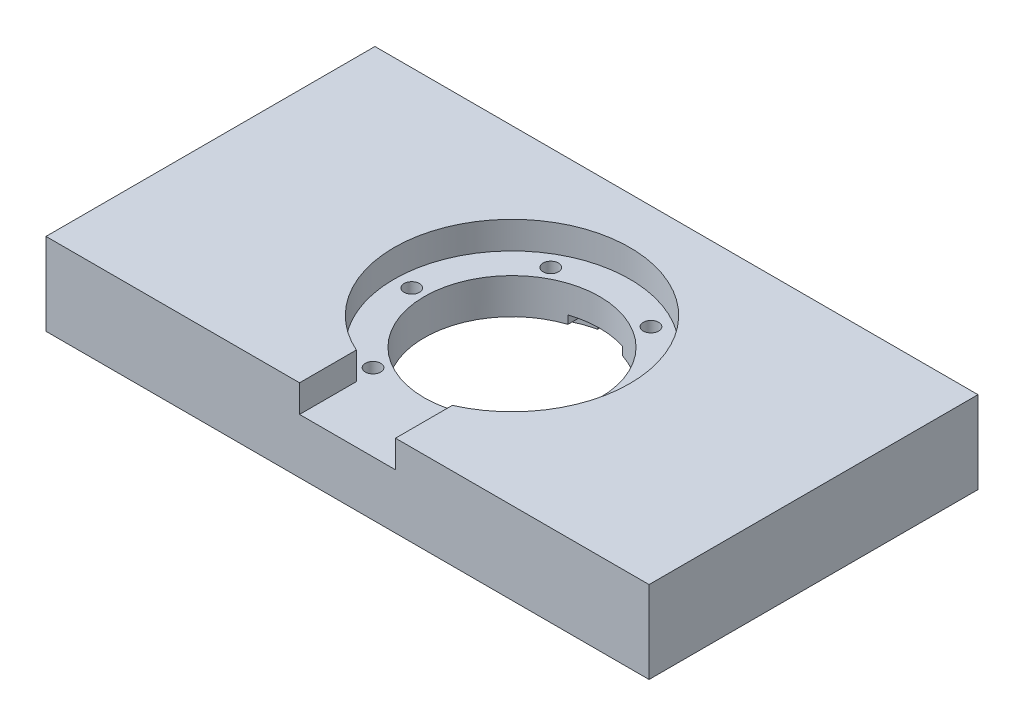
ISO-10303-21;
HEADER;
FILE_DESCRIPTION(('STEP AP214'),'2;1');
FILE_NAME('part.step','',(''),(''),'','','');
FILE_SCHEMA(('AUTOMOTIVE_DESIGN { 1 0 10303 214 1 1 1 1 }'));
ENDSEC;
DATA;
#1=APPLICATION_CONTEXT('core data for automotive mechanical design processes');
#2=APPLICATION_PROTOCOL_DEFINITION('international standard','automotive_design',2000,#1);
#3=PRODUCT_CONTEXT('',#1,'mechanical');
#4=PRODUCT('Part','Part','',(#3));
#5=PRODUCT_RELATED_PRODUCT_CATEGORY('part','',(#4));
#6=PRODUCT_DEFINITION_FORMATION('','',#4);
#7=PRODUCT_DEFINITION_CONTEXT('part definition',#1,'design');
#8=PRODUCT_DEFINITION('design','',#6,#7);
#9=PRODUCT_DEFINITION_SHAPE('','',#8);
#10=(LENGTH_UNIT() NAMED_UNIT(*) SI_UNIT(.MILLI.,.METRE.));
#11=(NAMED_UNIT(*) PLANE_ANGLE_UNIT() SI_UNIT($,.RADIAN.));
#12=(NAMED_UNIT(*) SI_UNIT($,.STERADIAN.) SOLID_ANGLE_UNIT());
#13=UNCERTAINTY_MEASURE_WITH_UNIT(LENGTH_MEASURE(1.E-05),#10,'distance_accuracy_value','');
#14=(GEOMETRIC_REPRESENTATION_CONTEXT(3) GLOBAL_UNCERTAINTY_ASSIGNED_CONTEXT((#13)) GLOBAL_UNIT_ASSIGNED_CONTEXT((#10,
#11,#12)) REPRESENTATION_CONTEXT('',''));
#15=CARTESIAN_POINT('',(0.,0.,0.));
#16=DIRECTION('',(0.,0.,1.));
#17=DIRECTION('',(1.,0.,0.));
#18=AXIS2_PLACEMENT_3D('',#15,#16,#17);
#19=CARTESIAN_POINT('',(18.1221367706661,-20.,32.2581487203663));
#20=DIRECTION('',(0.,1.,0.));
#21=DIRECTION('',(0.,0.,1.));
#22=AXIS2_PLACEMENT_3D('',#19,#20,#21);
#23=CYLINDRICAL_SURFACE('',#22,2.8);
#24=CARTESIAN_POINT('',(18.1221367706661,0.,32.2581487203663));
#25=DIRECTION('',(0.,-1.,0.));
#26=DIRECTION('',(0.,0.,-1.));
#27=AXIS2_PLACEMENT_3D('',#24,#25,#26);
#28=CIRCLE('',#27,2.8);
#29=CARTESIAN_POINT('',(18.1221367706661,0.,29.4581487203663));
#30=VERTEX_POINT('',#29);
#31=EDGE_CURVE('E240',#30,#30,#28,.T.);
#32=ORIENTED_EDGE('',*,*,#31,.F.);
#33=EDGE_LOOP('',(#32));
#34=FACE_BOUND('',#33,.T.);
#35=CARTESIAN_POINT('',(18.1221367706661,-13.,32.2581487203663));
#36=DIRECTION('',(0.,-1.,0.));
#37=DIRECTION('',(0.,0.,-1.));
#38=AXIS2_PLACEMENT_3D('',#35,#36,#37);
#39=CIRCLE('',#38,2.8);
#40=CARTESIAN_POINT('',(18.1221367706661,-13.,29.4581487203663));
#41=VERTEX_POINT('',#40);
#42=EDGE_CURVE('E311',#41,#41,#39,.T.);
#43=ORIENTED_EDGE('',*,*,#42,.T.);
#44=EDGE_LOOP('',(#43));
#45=FACE_BOUND('',#44,.T.);
#46=ADVANCED_FACE('F47',(#34,#45),#23,.F.);
#47=CARTESIAN_POINT('',(36.9974446562268,-20.,0.434843545930153));
#48=DIRECTION('',(0.,1.,0.));
#49=DIRECTION('',(0.,0.,1.));
#50=AXIS2_PLACEMENT_3D('',#47,#48,#49);
#51=CYLINDRICAL_SURFACE('',#50,2.8);
#52=CARTESIAN_POINT('',(36.9974446562268,0.,0.434843545930153));
#53=DIRECTION('',(0.,-1.,0.));
#54=DIRECTION('',(0.,0.,-1.));
#55=AXIS2_PLACEMENT_3D('',#52,#53,#54);
#56=CIRCLE('',#55,2.8);
#57=CARTESIAN_POINT('',(36.9974446562268,0.,-2.36515645406985));
#58=VERTEX_POINT('',#57);
#59=EDGE_CURVE('E236',#58,#58,#56,.T.);
#60=ORIENTED_EDGE('',*,*,#59,.F.);
#61=EDGE_LOOP('',(#60));
#62=FACE_BOUND('',#61,.T.);
#63=CARTESIAN_POINT('',(36.9974446562268,-13.,0.434843545930153));
#64=DIRECTION('',(0.,-1.,0.));
#65=DIRECTION('',(0.,0.,-1.));
#66=AXIS2_PLACEMENT_3D('',#63,#64,#65);
#67=CIRCLE('',#66,2.8);
#68=CARTESIAN_POINT('',(36.9974446562268,-13.,-2.36515645406985));
#69=VERTEX_POINT('',#68);
#70=EDGE_CURVE('E378',#69,#69,#67,.T.);
#71=ORIENTED_EDGE('',*,*,#70,.T.);
#72=EDGE_LOOP('',(#71));
#73=FACE_BOUND('',#72,.T.);
#74=ADVANCED_FACE('F416',(#62,#73),#51,.F.);
#75=CARTESIAN_POINT('',(18.8753078855607,-20.,-31.8233051744363));
#76=DIRECTION('',(0.,1.,0.));
#77=DIRECTION('',(0.,0.,1.));
#78=AXIS2_PLACEMENT_3D('',#75,#76,#77);
#79=CYLINDRICAL_SURFACE('',#78,2.8);
#80=CARTESIAN_POINT('',(18.8753078855607,0.,-31.8233051744363));
#81=DIRECTION('',(0.,-1.,0.));
#82=DIRECTION('',(0.,0.,-1.));
#83=AXIS2_PLACEMENT_3D('',#80,#81,#82);
#84=CIRCLE('',#83,2.8);
#85=CARTESIAN_POINT('',(18.8753078855607,0.,-34.6233051744363));
#86=VERTEX_POINT('',#85);
#87=EDGE_CURVE('E232',#86,#86,#84,.T.);
#88=ORIENTED_EDGE('',*,*,#87,.F.);
#89=EDGE_LOOP('',(#88));
#90=FACE_BOUND('',#89,.T.);
#91=CARTESIAN_POINT('',(18.8753078855607,-13.,-31.8233051744363));
#92=DIRECTION('',(0.,-1.,0.));
#93=DIRECTION('',(0.,0.,-1.));
#94=AXIS2_PLACEMENT_3D('',#91,#92,#93);
#95=CIRCLE('',#94,2.8);
#96=CARTESIAN_POINT('',(18.8753078855607,-13.,-34.6233051744363));
#97=VERTEX_POINT('',#96);
#98=EDGE_CURVE('E374',#97,#97,#95,.T.);
#99=ORIENTED_EDGE('',*,*,#98,.T.);
#100=EDGE_LOOP('',(#99));
#101=FACE_BOUND('',#100,.T.);
#102=ADVANCED_FACE('F423',(#90,#101),#79,.F.);
#103=CARTESIAN_POINT('',(-18.1221367706662,-20.,-32.2581487203665));
#104=DIRECTION('',(0.,1.,0.));
#105=DIRECTION('',(0.,0.,1.));
#106=AXIS2_PLACEMENT_3D('',#103,#104,#105);
#107=CYLINDRICAL_SURFACE('',#106,2.8);
#108=CARTESIAN_POINT('',(-18.1221367706662,0.,-32.2581487203665));
#109=DIRECTION('',(0.,-1.,0.));
#110=DIRECTION('',(0.,0.,-1.));
#111=AXIS2_PLACEMENT_3D('',#108,#109,#110);
#112=CIRCLE('',#111,2.8);
#113=CARTESIAN_POINT('',(-18.1221367706662,0.,-35.0581487203665));
#114=VERTEX_POINT('',#113);
#115=EDGE_CURVE('E228',#114,#114,#112,.T.);
#116=ORIENTED_EDGE('',*,*,#115,.F.);
#117=EDGE_LOOP('',(#116));
#118=FACE_BOUND('',#117,.T.);
#119=CARTESIAN_POINT('',(-18.1221367706662,-13.,-32.2581487203665));
#120=DIRECTION('',(0.,-1.,0.));
#121=DIRECTION('',(0.,0.,-1.));
#122=AXIS2_PLACEMENT_3D('',#119,#120,#121);
#123=CIRCLE('',#122,2.8);
#124=CARTESIAN_POINT('',(-18.1221367706662,-13.,-35.0581487203665));
#125=VERTEX_POINT('',#124);
#126=EDGE_CURVE('E370',#125,#125,#123,.T.);
#127=ORIENTED_EDGE('',*,*,#126,.T.);
#128=EDGE_LOOP('',(#127));
#129=FACE_BOUND('',#128,.T.);
#130=ADVANCED_FACE('F410',(#118,#129),#107,.F.);
#131=CARTESIAN_POINT('',(-36.9974446562269,-20.,-0.434843545930336));
#132=DIRECTION('',(0.,1.,0.));
#133=DIRECTION('',(0.,0.,1.));
#134=AXIS2_PLACEMENT_3D('',#131,#132,#133);
#135=CYLINDRICAL_SURFACE('',#134,2.8);
#136=CARTESIAN_POINT('',(-36.9974446562269,0.,-0.434843545930336));
#137=DIRECTION('',(0.,-1.,0.));
#138=DIRECTION('',(0.,0.,-1.));
#139=AXIS2_PLACEMENT_3D('',#136,#137,#138);
#140=CIRCLE('',#139,2.8);
#141=CARTESIAN_POINT('',(-36.9974446562269,0.,-3.23484354593033));
#142=VERTEX_POINT('',#141);
#143=EDGE_CURVE('E224',#142,#142,#140,.T.);
#144=ORIENTED_EDGE('',*,*,#143,.F.);
#145=EDGE_LOOP('',(#144));
#146=FACE_BOUND('',#145,.T.);
#147=CARTESIAN_POINT('',(-36.9974446562269,-13.,-0.434843545930336));
#148=DIRECTION('',(0.,-1.,0.));
#149=DIRECTION('',(0.,0.,-1.));
#150=AXIS2_PLACEMENT_3D('',#147,#148,#149);
#151=CIRCLE('',#150,2.8);
#152=CARTESIAN_POINT('',(-36.9974446562269,-13.,-3.23484354593033));
#153=VERTEX_POINT('',#152);
#154=EDGE_CURVE('E363',#153,#153,#151,.T.);
#155=ORIENTED_EDGE('',*,*,#154,.T.);
#156=EDGE_LOOP('',(#155));
#157=FACE_BOUND('',#156,.T.);
#158=ADVANCED_FACE('F401',(#146,#157),#135,.F.);
#159=CARTESIAN_POINT('',(-18.8753078855608,-20.,31.8233051744361));
#160=DIRECTION('',(0.,1.,0.));
#161=DIRECTION('',(0.,0.,1.));
#162=AXIS2_PLACEMENT_3D('',#159,#160,#161);
#163=CYLINDRICAL_SURFACE('',#162,2.8);
#164=CARTESIAN_POINT('',(-18.8753078855608,0.,31.8233051744361));
#165=DIRECTION('',(0.,-1.,0.));
#166=DIRECTION('',(0.,0.,-1.));
#167=AXIS2_PLACEMENT_3D('',#164,#165,#166);
#168=CIRCLE('',#167,2.8);
#169=CARTESIAN_POINT('',(-18.8753078855608,0.,29.0233051744361));
#170=VERTEX_POINT('',#169);
#171=EDGE_CURVE('E211',#170,#170,#168,.T.);
#172=ORIENTED_EDGE('',*,*,#171,.F.);
#173=EDGE_LOOP('',(#172));
#174=FACE_BOUND('',#173,.T.);
#175=CARTESIAN_POINT('',(-18.8753078855608,-13.,31.8233051744361));
#176=DIRECTION('',(0.,-1.,0.));
#177=DIRECTION('',(0.,0.,-1.));
#178=AXIS2_PLACEMENT_3D('',#175,#176,#177);
#179=CIRCLE('',#178,2.8);
#180=CARTESIAN_POINT('',(-18.8753078855608,-13.,29.0233051744361));
#181=VERTEX_POINT('',#180);
#182=EDGE_CURVE('E358',#181,#181,#179,.T.);
#183=ORIENTED_EDGE('',*,*,#182,.T.);
#184=EDGE_LOOP('',(#183));
#185=FACE_BOUND('',#184,.T.);
#186=ADVANCED_FACE('F399',(#174,#185),#163,.F.);
#187=CARTESIAN_POINT('',(0.,-20.,0.));
#188=DIRECTION('',(0.,1.,0.));
#189=DIRECTION('',(0.,0.,1.));
#190=AXIS2_PLACEMENT_3D('',#187,#188,#189);
#191=CYLINDRICAL_SURFACE('',#190,32.);
#192=CARTESIAN_POINT('',(0.,0.,0.));
#193=DIRECTION('',(0.,1.,0.));
#194=DIRECTION('',(0.,0.,1.));
#195=AXIS2_PLACEMENT_3D('',#192,#193,#194);
#196=CIRCLE('',#195,32.);
#197=CARTESIAN_POINT('',(0.,0.,32.));
#198=VERTEX_POINT('',#197);
#199=EDGE_CURVE('E184',#198,#198,#196,.T.);
#200=ORIENTED_EDGE('',*,*,#199,.T.);
#201=EDGE_LOOP('',(#200));
#202=FACE_BOUND('',#201,.T.);
#203=CARTESIAN_POINT('',(0.,-13.,0.));
#204=DIRECTION('',(0.,-1.,0.));
#205=DIRECTION('',(0.,0.,-1.));
#206=AXIS2_PLACEMENT_3D('',#203,#204,#205);
#207=CIRCLE('',#206,32.);
#208=CARTESIAN_POINT('',(-10.,-13.,-30.3973683071413));
#209=VERTEX_POINT('',#208);
#210=CARTESIAN_POINT('',(9.99999999999999,-13.,-30.3973683071413));
#211=VERTEX_POINT('',#210);
#212=EDGE_CURVE('E63',#209,#211,#207,.F.);
#213=ORIENTED_EDGE('',*,*,#212,.F.);
#214=DIRECTION('',(0.,1.,0.));
#215=VECTOR('',#214,1.);
#216=CARTESIAN_POINT('',(-10.,-20.,-30.3973683071413));
#217=LINE('',#216,#215);
#218=CARTESIAN_POINT('',(-10.,-10.,-30.3973683071413));
#219=VERTEX_POINT('',#218);
#220=EDGE_CURVE('E304',#219,#209,#217,.F.);
#221=ORIENTED_EDGE('',*,*,#220,.F.);
#222=CARTESIAN_POINT('',(0.,-10.,0.));
#223=DIRECTION('',(0.,1.,0.));
#224=DIRECTION('',(0.,0.,1.));
#225=AXIS2_PLACEMENT_3D('',#222,#223,#224);
#226=CIRCLE('',#225,32.);
#227=CARTESIAN_POINT('',(9.99999999999999,-10.,-30.3973683071413));
#228=VERTEX_POINT('',#227);
#229=EDGE_CURVE('E173',#228,#219,#226,.T.);
#230=ORIENTED_EDGE('',*,*,#229,.F.);
#231=DIRECTION('',(0.,1.,0.));
#232=VECTOR('',#231,1.);
#233=CARTESIAN_POINT('',(9.99999999999999,-20.,-30.3973683071413));
#234=LINE('',#233,#232);
#235=EDGE_CURVE('E70',#211,#228,#234,.T.);
#236=ORIENTED_EDGE('',*,*,#235,.F.);
#237=EDGE_LOOP('',(#213,#221,#230,#236));
#238=FACE_BOUND('',#237,.T.);
#239=ADVANCED_FACE('F300',(#202,#238),#191,.F.);
#240=CARTESIAN_POINT('',(0.,10.,0.));
#241=DIRECTION('',(0.,1.,0.));
#242=DIRECTION('',(0.,0.,1.));
#243=AXIS2_PLACEMENT_3D('',#240,#241,#242);
#244=PLANE('',#243);
#245=DIRECTION('',(0.,0.,1.));
#246=VECTOR('',#245,1.);
#247=CARTESIAN_POINT('',(-17.5,10.,-60.001));
#248=LINE('',#247,#246);
#249=CARTESIAN_POINT('',(-17.5,10.,39.2778563569857));
#250=VERTEX_POINT('',#249);
#251=CARTESIAN_POINT('',(-17.5,10.,60.));
#252=VERTEX_POINT('',#251);
#253=EDGE_CURVE('E215',#250,#252,#248,.T.);
#254=ORIENTED_EDGE('',*,*,#253,.F.);
#255=CARTESIAN_POINT('',(0.,10.,0.));
#256=DIRECTION('',(0.,1.,0.));
#257=DIRECTION('',(0.,0.,1.));
#258=AXIS2_PLACEMENT_3D('',#255,#256,#257);
#259=CIRCLE('',#258,43.);
#260=CARTESIAN_POINT('',(17.5,10.,39.2778563569857));
#261=VERTEX_POINT('',#260);
#262=EDGE_CURVE('E261',#261,#250,#259,.T.);
#263=ORIENTED_EDGE('',*,*,#262,.F.);
#264=DIRECTION('',(0.,0.,1.));
#265=VECTOR('',#264,1.);
#266=CARTESIAN_POINT('',(17.5,10.,-60.001));
#267=LINE('',#266,#265);
#268=CARTESIAN_POINT('',(17.5,10.,60.));
#269=VERTEX_POINT('',#268);
#270=EDGE_CURVE('E207',#261,#269,#267,.T.);
#271=ORIENTED_EDGE('',*,*,#270,.T.);
#272=DIRECTION('',(1.,0.,0.));
#273=VECTOR('',#272,1.);
#274=CARTESIAN_POINT('',(110.,10.,60.));
#275=LINE('',#274,#273);
#276=CARTESIAN_POINT('',(110.,10.,60.));
#277=VERTEX_POINT('',#276);
#278=EDGE_CURVE('E272',#269,#277,#275,.T.);
#279=ORIENTED_EDGE('',*,*,#278,.T.);
#280=DIRECTION('',(0.,0.,-1.));
#281=VECTOR('',#280,1.);
#282=CARTESIAN_POINT('',(110.,10.,60.));
#283=LINE('',#282,#281);
#284=CARTESIAN_POINT('',(110.,10.,-60.));
#285=VERTEX_POINT('',#284);
#286=EDGE_CURVE('E277',#277,#285,#283,.T.);
#287=ORIENTED_EDGE('',*,*,#286,.T.);
#288=DIRECTION('',(-1.,0.,0.));
#289=VECTOR('',#288,1.);
#290=CARTESIAN_POINT('',(110.,10.,-60.));
#291=LINE('',#290,#289);
#292=CARTESIAN_POINT('',(-110.,10.,-60.));
#293=VERTEX_POINT('',#292);
#294=EDGE_CURVE('E280',#285,#293,#291,.T.);
#295=ORIENTED_EDGE('',*,*,#294,.T.);
#296=DIRECTION('',(0.,0.,1.));
#297=VECTOR('',#296,1.);
#298=CARTESIAN_POINT('',(-110.,10.,60.));
#299=LINE('',#298,#297);
#300=CARTESIAN_POINT('',(-110.,10.,60.));
#301=VERTEX_POINT('',#300);
#302=EDGE_CURVE('E265',#293,#301,#299,.T.);
#303=ORIENTED_EDGE('',*,*,#302,.T.);
#304=EDGE_CURVE('E273',#301,#252,#275,.T.);
#305=ORIENTED_EDGE('',*,*,#304,.T.);
#306=EDGE_LOOP('',(#254,#263,#271,#279,#287,#295,#303,#305));
#307=FACE_BOUND('',#306,.T.);
#308=ADVANCED_FACE('F337',(#307),#244,.T.);
#309=CARTESIAN_POINT('',(-110.,10.,60.));
#310=DIRECTION('',(1.,0.,0.));
#311=DIRECTION('',(0.,0.,-1.));
#312=AXIS2_PLACEMENT_3D('',#309,#310,#311);
#313=PLANE('',#312);
#314=DIRECTION('',(0.,-1.,0.));
#315=VECTOR('',#314,1.);
#316=CARTESIAN_POINT('',(-110.,10.,-60.));
#317=LINE('',#316,#315);
#318=CARTESIAN_POINT('',(-110.,-20.,-60.));
#319=VERTEX_POINT('',#318);
#320=EDGE_CURVE('E283',#293,#319,#317,.T.);
#321=ORIENTED_EDGE('',*,*,#320,.T.);
#322=DIRECTION('',(0.,0.,-1.));
#323=VECTOR('',#322,1.);
#324=CARTESIAN_POINT('',(-110.,-20.,60.));
#325=LINE('',#324,#323);
#326=CARTESIAN_POINT('',(-110.,-20.,60.));
#327=VERTEX_POINT('',#326);
#328=EDGE_CURVE('E244',#327,#319,#325,.T.);
#329=ORIENTED_EDGE('',*,*,#328,.F.);
#330=DIRECTION('',(0.,-1.,0.));
#331=VECTOR('',#330,1.);
#332=CARTESIAN_POINT('',(-110.,10.,60.));
#333=LINE('',#332,#331);
#334=EDGE_CURVE('E293',#301,#327,#333,.T.);
#335=ORIENTED_EDGE('',*,*,#334,.F.);
#336=ORIENTED_EDGE('',*,*,#302,.F.);
#337=EDGE_LOOP('',(#321,#329,#335,#336));
#338=FACE_BOUND('',#337,.T.);
#339=ADVANCED_FACE('F49',(#338),#313,.F.);
#340=CARTESIAN_POINT('',(110.,10.,60.));
#341=DIRECTION('',(0.,0.,-1.));
#342=DIRECTION('',(-1.,0.,0.));
#343=AXIS2_PLACEMENT_3D('',#340,#341,#342);
#344=PLANE('',#343);
#345=DIRECTION('',(1.,0.,0.));
#346=VECTOR('',#345,1.);
#347=CARTESIAN_POINT('',(-17.5,0.,60.));
#348=LINE('',#347,#346);
#349=CARTESIAN_POINT('',(-17.5,0.,60.));
#350=VERTEX_POINT('',#349);
#351=CARTESIAN_POINT('',(17.5,0.,60.));
#352=VERTEX_POINT('',#351);
#353=EDGE_CURVE('E203',#350,#352,#348,.T.);
#354=ORIENTED_EDGE('',*,*,#353,.F.);
#355=DIRECTION('',(0.,-1.,0.));
#356=VECTOR('',#355,1.);
#357=CARTESIAN_POINT('',(-17.5,0.,60.));
#358=LINE('',#357,#356);
#359=EDGE_CURVE('E199',#252,#350,#358,.T.);
#360=ORIENTED_EDGE('',*,*,#359,.F.);
#361=ORIENTED_EDGE('',*,*,#304,.F.);
#362=ORIENTED_EDGE('',*,*,#334,.T.);
#363=DIRECTION('',(-1.,0.,0.));
#364=VECTOR('',#363,1.);
#365=CARTESIAN_POINT('',(-110.,-20.,60.));
#366=LINE('',#365,#364);
#367=CARTESIAN_POINT('',(110.,-20.,60.));
#368=VERTEX_POINT('',#367);
#369=EDGE_CURVE('E256',#368,#327,#366,.T.);
#370=ORIENTED_EDGE('',*,*,#369,.F.);
#371=DIRECTION('',(0.,-1.,0.));
#372=VECTOR('',#371,1.);
#373=CARTESIAN_POINT('',(110.,10.,60.));
#374=LINE('',#373,#372);
#375=EDGE_CURVE('E290',#277,#368,#374,.T.);
#376=ORIENTED_EDGE('',*,*,#375,.F.);
#377=ORIENTED_EDGE('',*,*,#278,.F.);
#378=DIRECTION('',(0.,1.,0.));
#379=VECTOR('',#378,1.);
#380=CARTESIAN_POINT('',(17.5,0.,60.));
#381=LINE('',#380,#379);
#382=EDGE_CURVE('E196',#352,#269,#381,.T.);
#383=ORIENTED_EDGE('',*,*,#382,.F.);
#384=EDGE_LOOP('',(#354,#360,#361,#362,#370,#376,#377,#383));
#385=FACE_BOUND('',#384,.T.);
#386=ADVANCED_FACE('F344',(#385),#344,.F.);
#387=CARTESIAN_POINT('',(110.,10.,60.));
#388=DIRECTION('',(-1.,0.,0.));
#389=DIRECTION('',(0.,0.,1.));
#390=AXIS2_PLACEMENT_3D('',#387,#388,#389);
#391=PLANE('',#390);
#392=ORIENTED_EDGE('',*,*,#375,.T.);
#393=DIRECTION('',(0.,0.,1.));
#394=VECTOR('',#393,1.);
#395=CARTESIAN_POINT('',(110.,-20.,60.));
#396=LINE('',#395,#394);
#397=CARTESIAN_POINT('',(110.,-20.,-60.));
#398=VERTEX_POINT('',#397);
#399=EDGE_CURVE('E252',#398,#368,#396,.T.);
#400=ORIENTED_EDGE('',*,*,#399,.F.);
#401=DIRECTION('',(0.,-1.,0.));
#402=VECTOR('',#401,1.);
#403=CARTESIAN_POINT('',(110.,10.,-60.));
#404=LINE('',#403,#402);
#405=EDGE_CURVE('E286',#285,#398,#404,.T.);
#406=ORIENTED_EDGE('',*,*,#405,.F.);
#407=ORIENTED_EDGE('',*,*,#286,.F.);
#408=EDGE_LOOP('',(#392,#400,#406,#407));
#409=FACE_BOUND('',#408,.T.);
#410=ADVANCED_FACE('F346',(#409),#391,.F.);
#411=CARTESIAN_POINT('',(110.,10.,-60.));
#412=DIRECTION('',(0.,0.,1.));
#413=DIRECTION('',(1.,0.,0.));
#414=AXIS2_PLACEMENT_3D('',#411,#412,#413);
#415=PLANE('',#414);
#416=DIRECTION('',(1.,0.,0.));
#417=VECTOR('',#416,1.);
#418=CARTESIAN_POINT('',(9.99999999999999,-10.,-60.));
#419=LINE('',#418,#417);
#420=CARTESIAN_POINT('',(-10.,-10.,-60.));
#421=VERTEX_POINT('',#420);
#422=CARTESIAN_POINT('',(9.99999999999999,-10.,-60.));
#423=VERTEX_POINT('',#422);
#424=EDGE_CURVE('E318',#421,#423,#419,.T.);
#425=ORIENTED_EDGE('',*,*,#424,.F.);
#426=DIRECTION('',(0.,1.,0.));
#427=VECTOR('',#426,1.);
#428=CARTESIAN_POINT('',(-10.,-10.,-60.));
#429=LINE('',#428,#427);
#430=CARTESIAN_POINT('',(-10.,-20.,-60.));
#431=VERTEX_POINT('',#430);
#432=EDGE_CURVE('E309',#431,#421,#429,.T.);
#433=ORIENTED_EDGE('',*,*,#432,.F.);
#434=DIRECTION('',(1.,0.,0.));
#435=VECTOR('',#434,1.);
#436=CARTESIAN_POINT('',(-110.,-20.,-60.));
#437=LINE('',#436,#435);
#438=EDGE_CURVE('E249',#319,#431,#437,.T.);
#439=ORIENTED_EDGE('',*,*,#438,.F.);
#440=ORIENTED_EDGE('',*,*,#320,.F.);
#441=ORIENTED_EDGE('',*,*,#294,.F.);
#442=ORIENTED_EDGE('',*,*,#405,.T.);
#443=CARTESIAN_POINT('',(9.99999999999999,-20.,-60.));
#444=VERTEX_POINT('',#443);
#445=EDGE_CURVE('E248',#444,#398,#437,.T.);
#446=ORIENTED_EDGE('',*,*,#445,.F.);
#447=DIRECTION('',(0.,-1.,0.));
#448=VECTOR('',#447,1.);
#449=CARTESIAN_POINT('',(9.99999999999999,-10.,-60.));
#450=LINE('',#449,#448);
#451=EDGE_CURVE('E166',#423,#444,#450,.T.);
#452=ORIENTED_EDGE('',*,*,#451,.F.);
#453=EDGE_LOOP('',(#425,#433,#439,#440,#441,#442,#446,#452));
#454=FACE_BOUND('',#453,.T.);
#455=ADVANCED_FACE('F327',(#454),#415,.F.);
#456=CARTESIAN_POINT('',(0.,10.,0.));
#457=DIRECTION('',(0.,-1.,0.));
#458=DIRECTION('',(0.,0.,-1.));
#459=AXIS2_PLACEMENT_3D('',#456,#457,#458);
#460=CYLINDRICAL_SURFACE('',#459,43.);
#461=DIRECTION('',(0.,-1.,0.));
#462=VECTOR('',#461,1.);
#463=CARTESIAN_POINT('',(-17.5,10.,39.2778563569857));
#464=LINE('',#463,#462);
#465=CARTESIAN_POINT('',(-17.5,0.,39.2778563569857));
#466=VERTEX_POINT('',#465);
#467=EDGE_CURVE('E188',#250,#466,#464,.T.);
#468=ORIENTED_EDGE('',*,*,#467,.T.);
#469=CARTESIAN_POINT('',(0.,0.,0.));
#470=DIRECTION('',(0.,1.,0.));
#471=DIRECTION('',(0.,0.,1.));
#472=AXIS2_PLACEMENT_3D('',#469,#470,#471);
#473=CIRCLE('',#472,43.);
#474=CARTESIAN_POINT('',(17.5,0.,39.2778563569857));
#475=VERTEX_POINT('',#474);
#476=EDGE_CURVE('E260',#475,#466,#473,.T.);
#477=ORIENTED_EDGE('',*,*,#476,.F.);
#478=DIRECTION('',(0.,-1.,0.));
#479=VECTOR('',#478,1.);
#480=CARTESIAN_POINT('',(17.5,10.,39.2778563569857));
#481=LINE('',#480,#479);
#482=EDGE_CURVE('E192',#475,#261,#481,.F.);
#483=ORIENTED_EDGE('',*,*,#482,.T.);
#484=ORIENTED_EDGE('',*,*,#262,.T.);
#485=EDGE_LOOP('',(#468,#477,#483,#484));
#486=FACE_BOUND('',#485,.T.);
#487=ADVANCED_FACE('F435',(#486),#460,.F.);
#488=CARTESIAN_POINT('',(0.,0.,0.));
#489=DIRECTION('',(0.,-1.,0.));
#490=DIRECTION('',(0.,0.,-1.));
#491=AXIS2_PLACEMENT_3D('',#488,#489,#490);
#492=PLANE('',#491);
#493=ORIENTED_EDGE('',*,*,#199,.F.);
#494=EDGE_LOOP('',(#493));
#495=FACE_BOUND('',#494,.T.);
#496=ORIENTED_EDGE('',*,*,#171,.T.);
#497=EDGE_LOOP('',(#496));
#498=FACE_BOUND('',#497,.T.);
#499=ORIENTED_EDGE('',*,*,#143,.T.);
#500=EDGE_LOOP('',(#499));
#501=FACE_BOUND('',#500,.T.);
#502=ORIENTED_EDGE('',*,*,#115,.T.);
#503=EDGE_LOOP('',(#502));
#504=FACE_BOUND('',#503,.T.);
#505=ORIENTED_EDGE('',*,*,#87,.T.);
#506=EDGE_LOOP('',(#505));
#507=FACE_BOUND('',#506,.T.);
#508=ORIENTED_EDGE('',*,*,#59,.T.);
#509=EDGE_LOOP('',(#508));
#510=FACE_BOUND('',#509,.T.);
#511=ORIENTED_EDGE('',*,*,#31,.T.);
#512=EDGE_LOOP('',(#511));
#513=FACE_BOUND('',#512,.T.);
#514=ORIENTED_EDGE('',*,*,#476,.T.);
#515=DIRECTION('',(0.,0.,1.));
#516=VECTOR('',#515,1.);
#517=CARTESIAN_POINT('',(-17.5,0.,-60.001));
#518=LINE('',#517,#516);
#519=EDGE_CURVE('E212',#466,#350,#518,.T.);
#520=ORIENTED_EDGE('',*,*,#519,.T.);
#521=ORIENTED_EDGE('',*,*,#353,.T.);
#522=DIRECTION('',(0.,0.,1.));
#523=VECTOR('',#522,1.);
#524=CARTESIAN_POINT('',(17.5,0.,-60.001));
#525=LINE('',#524,#523);
#526=EDGE_CURVE('E208',#475,#352,#525,.T.);
#527=ORIENTED_EDGE('',*,*,#526,.F.);
#528=EDGE_LOOP('',(#514,#520,#521,#527));
#529=FACE_BOUND('',#528,.T.);
#530=ADVANCED_FACE('F432',(#495,#498,#501,#504,#507,#510,#513,#529),#492,.F.);
#531=CARTESIAN_POINT('',(0.,-20.,0.));
#532=DIRECTION('',(0.,-1.,0.));
#533=DIRECTION('',(0.,0.,-1.));
#534=AXIS2_PLACEMENT_3D('',#531,#532,#533);
#535=PLANE('',#534);
#536=CARTESIAN_POINT('',(0.,-20.,0.));
#537=DIRECTION('',(0.,-1.,0.));
#538=DIRECTION('',(0.,0.,-1.));
#539=AXIS2_PLACEMENT_3D('',#536,#537,#538);
#540=CIRCLE('',#539,42.5);
#541=CARTESIAN_POINT('',(9.99999999999999,-20.,-41.3067791046458));
#542=VERTEX_POINT('',#541);
#543=CARTESIAN_POINT('',(-10.,-20.,-41.3067791046458));
#544=VERTEX_POINT('',#543);
#545=EDGE_CURVE('E150',#542,#544,#540,.T.);
#546=ORIENTED_EDGE('',*,*,#545,.F.);
#547=DIRECTION('',(0.,0.,-1.));
#548=VECTOR('',#547,1.);
#549=CARTESIAN_POINT('',(10.,-20.,60.001));
#550=LINE('',#549,#548);
#551=EDGE_CURVE('E158',#542,#444,#550,.T.);
#552=ORIENTED_EDGE('',*,*,#551,.T.);
#553=ORIENTED_EDGE('',*,*,#445,.T.);
#554=ORIENTED_EDGE('',*,*,#399,.T.);
#555=ORIENTED_EDGE('',*,*,#369,.T.);
#556=ORIENTED_EDGE('',*,*,#328,.T.);
#557=ORIENTED_EDGE('',*,*,#438,.T.);
#558=DIRECTION('',(0.,0.,-1.));
#559=VECTOR('',#558,1.);
#560=CARTESIAN_POINT('',(-9.99999999999999,-20.,60.001));
#561=LINE('',#560,#559);
#562=EDGE_CURVE('E161',#544,#431,#561,.T.);
#563=ORIENTED_EDGE('',*,*,#562,.F.);
#564=EDGE_LOOP('',(#546,#552,#553,#554,#555,#556,#557,#563));
#565=FACE_BOUND('',#564,.T.);
#566=ADVANCED_FACE('F157',(#565),#535,.T.);
#567=CARTESIAN_POINT('',(-17.5,0.,-60.001));
#568=DIRECTION('',(-1.,0.,0.));
#569=DIRECTION('',(0.,0.,1.));
#570=AXIS2_PLACEMENT_3D('',#567,#568,#569);
#571=PLANE('',#570);
#572=ORIENTED_EDGE('',*,*,#253,.T.);
#573=ORIENTED_EDGE('',*,*,#359,.T.);
#574=ORIENTED_EDGE('',*,*,#519,.F.);
#575=ORIENTED_EDGE('',*,*,#467,.F.);
#576=EDGE_LOOP('',(#572,#573,#574,#575));
#577=FACE_BOUND('',#576,.T.);
#578=ADVANCED_FACE('F431',(#577),#571,.F.);
#579=CARTESIAN_POINT('',(17.5,0.,-60.001));
#580=DIRECTION('',(1.,0.,0.));
#581=DIRECTION('',(0.,0.,-1.));
#582=AXIS2_PLACEMENT_3D('',#579,#580,#581);
#583=PLANE('',#582);
#584=ORIENTED_EDGE('',*,*,#526,.T.);
#585=ORIENTED_EDGE('',*,*,#382,.T.);
#586=ORIENTED_EDGE('',*,*,#270,.F.);
#587=ORIENTED_EDGE('',*,*,#482,.F.);
#588=EDGE_LOOP('',(#584,#585,#586,#587));
#589=FACE_BOUND('',#588,.T.);
#590=ADVANCED_FACE('F500',(#589),#583,.F.);
#591=CARTESIAN_POINT('',(-9.99999999999999,-10.,60.001));
#592=DIRECTION('',(-1.,0.,0.));
#593=DIRECTION('',(0.,-1.,0.));
#594=AXIS2_PLACEMENT_3D('',#591,#592,#593);
#595=PLANE('',#594);
#596=DIRECTION('',(0.,0.,1.));
#597=VECTOR('',#596,1.);
#598=CARTESIAN_POINT('',(-9.99999999999999,-13.,60.001));
#599=LINE('',#598,#597);
#600=CARTESIAN_POINT('',(-10.,-13.,-41.3067791046458));
#601=VERTEX_POINT('',#600);
#602=EDGE_CURVE('E356',#601,#209,#599,.T.);
#603=ORIENTED_EDGE('',*,*,#602,.F.);
#604=DIRECTION('',(0.,-1.,0.));
#605=VECTOR('',#604,1.);
#606=CARTESIAN_POINT('',(-10.,-13.,-41.3067791046458));
#607=LINE('',#606,#605);
#608=EDGE_CURVE('E305',#601,#544,#607,.T.);
#609=ORIENTED_EDGE('',*,*,#608,.T.);
#610=ORIENTED_EDGE('',*,*,#562,.T.);
#611=ORIENTED_EDGE('',*,*,#432,.T.);
#612=DIRECTION('',(0.,0.,-1.));
#613=VECTOR('',#612,1.);
#614=CARTESIAN_POINT('',(-9.99999999999999,-10.,60.001));
#615=LINE('',#614,#613);
#616=EDGE_CURVE('E175',#219,#421,#615,.T.);
#617=ORIENTED_EDGE('',*,*,#616,.F.);
#618=ORIENTED_EDGE('',*,*,#220,.T.);
#619=EDGE_LOOP('',(#603,#609,#610,#611,#617,#618));
#620=FACE_BOUND('',#619,.T.);
#621=ADVANCED_FACE('F355',(#620),#595,.F.);
#622=CARTESIAN_POINT('',(10.,-10.,60.001));
#623=DIRECTION('',(1.,0.,0.));
#624=DIRECTION('',(0.,1.,0.));
#625=AXIS2_PLACEMENT_3D('',#622,#623,#624);
#626=PLANE('',#625);
#627=ORIENTED_EDGE('',*,*,#551,.F.);
#628=DIRECTION('',(0.,-1.,0.));
#629=VECTOR('',#628,1.);
#630=CARTESIAN_POINT('',(9.99999999999999,-13.,-41.3067791046458));
#631=LINE('',#630,#629);
#632=CARTESIAN_POINT('',(9.99999999999999,-13.,-41.3067791046458));
#633=VERTEX_POINT('',#632);
#634=EDGE_CURVE('E11',#542,#633,#631,.F.);
#635=ORIENTED_EDGE('',*,*,#634,.T.);
#636=DIRECTION('',(0.,0.,-1.));
#637=VECTOR('',#636,1.);
#638=CARTESIAN_POINT('',(10.,-13.,60.001));
#639=LINE('',#638,#637);
#640=EDGE_CURVE('E56',#211,#633,#639,.T.);
#641=ORIENTED_EDGE('',*,*,#640,.F.);
#642=ORIENTED_EDGE('',*,*,#235,.T.);
#643=DIRECTION('',(0.,0.,-1.));
#644=VECTOR('',#643,1.);
#645=CARTESIAN_POINT('',(10.,-10.,60.001));
#646=LINE('',#645,#644);
#647=EDGE_CURVE('E169',#228,#423,#646,.T.);
#648=ORIENTED_EDGE('',*,*,#647,.T.);
#649=ORIENTED_EDGE('',*,*,#451,.T.);
#650=EDGE_LOOP('',(#627,#635,#641,#642,#648,#649));
#651=FACE_BOUND('',#650,.T.);
#652=ADVANCED_FACE('F164',(#651),#626,.F.);
#653=CARTESIAN_POINT('',(10.,-10.,60.001));
#654=DIRECTION('',(0.,1.,0.));
#655=DIRECTION('',(0.,0.,1.));
#656=AXIS2_PLACEMENT_3D('',#653,#654,#655);
#657=PLANE('',#656);
#658=ORIENTED_EDGE('',*,*,#229,.T.);
#659=ORIENTED_EDGE('',*,*,#616,.T.);
#660=ORIENTED_EDGE('',*,*,#424,.T.);
#661=ORIENTED_EDGE('',*,*,#647,.F.);
#662=EDGE_LOOP('',(#658,#659,#660,#661));
#663=FACE_BOUND('',#662,.T.);
#664=ADVANCED_FACE('F324',(#663),#657,.F.);
#665=CARTESIAN_POINT('',(0.,-13.,0.));
#666=DIRECTION('',(0.,-1.,0.));
#667=DIRECTION('',(0.,0.,-1.));
#668=AXIS2_PLACEMENT_3D('',#665,#666,#667);
#669=CYLINDRICAL_SURFACE('',#668,42.5);
#670=CARTESIAN_POINT('',(0.,-13.,0.));
#671=DIRECTION('',(0.,-1.,0.));
#672=DIRECTION('',(0.,0.,-1.));
#673=AXIS2_PLACEMENT_3D('',#670,#671,#672);
#674=CIRCLE('',#673,42.5);
#675=EDGE_CURVE('E153',#633,#601,#674,.T.);
#676=ORIENTED_EDGE('',*,*,#675,.F.);
#677=ORIENTED_EDGE('',*,*,#634,.F.);
#678=ORIENTED_EDGE('',*,*,#545,.T.);
#679=ORIENTED_EDGE('',*,*,#608,.F.);
#680=EDGE_LOOP('',(#676,#677,#678,#679));
#681=FACE_BOUND('',#680,.T.);
#682=ADVANCED_FACE('F149',(#681),#669,.F.);
#683=CARTESIAN_POINT('',(0.,-13.,0.));
#684=DIRECTION('',(0.,-1.,0.));
#685=DIRECTION('',(0.,0.,-1.));
#686=AXIS2_PLACEMENT_3D('',#683,#684,#685);
#687=PLANE('',#686);
#688=ORIENTED_EDGE('',*,*,#42,.F.);
#689=EDGE_LOOP('',(#688));
#690=FACE_BOUND('',#689,.T.);
#691=ORIENTED_EDGE('',*,*,#70,.F.);
#692=EDGE_LOOP('',(#691));
#693=FACE_BOUND('',#692,.T.);
#694=ORIENTED_EDGE('',*,*,#98,.F.);
#695=EDGE_LOOP('',(#694));
#696=FACE_BOUND('',#695,.T.);
#697=ORIENTED_EDGE('',*,*,#126,.F.);
#698=EDGE_LOOP('',(#697));
#699=FACE_BOUND('',#698,.T.);
#700=ORIENTED_EDGE('',*,*,#154,.F.);
#701=EDGE_LOOP('',(#700));
#702=FACE_BOUND('',#701,.T.);
#703=ORIENTED_EDGE('',*,*,#182,.F.);
#704=EDGE_LOOP('',(#703));
#705=FACE_BOUND('',#704,.T.);
#706=ORIENTED_EDGE('',*,*,#602,.T.);
#707=ORIENTED_EDGE('',*,*,#212,.T.);
#708=ORIENTED_EDGE('',*,*,#640,.T.);
#709=ORIENTED_EDGE('',*,*,#675,.T.);
#710=EDGE_LOOP('',(#706,#707,#708,#709));
#711=FACE_BOUND('',#710,.T.);
#712=ADVANCED_FACE('F296',(#690,#693,#696,#699,#702,#705,#711),#687,.T.);
#713=CLOSED_SHELL('',(#46,#74,#102,#130,#158,#186,#239,#308,#339,#386,#410,#455,#487,#530,#566,
#578,#590,#621,#652,#664,#682,#712));
#714=MANIFOLD_SOLID_BREP('B2',#713);
#715=ADVANCED_BREP_SHAPE_REPRESENTATION('',(#18,#714),#14);
#716=SHAPE_DEFINITION_REPRESENTATION(#9,#715);
ENDSEC;
END-ISO-10303-21;
